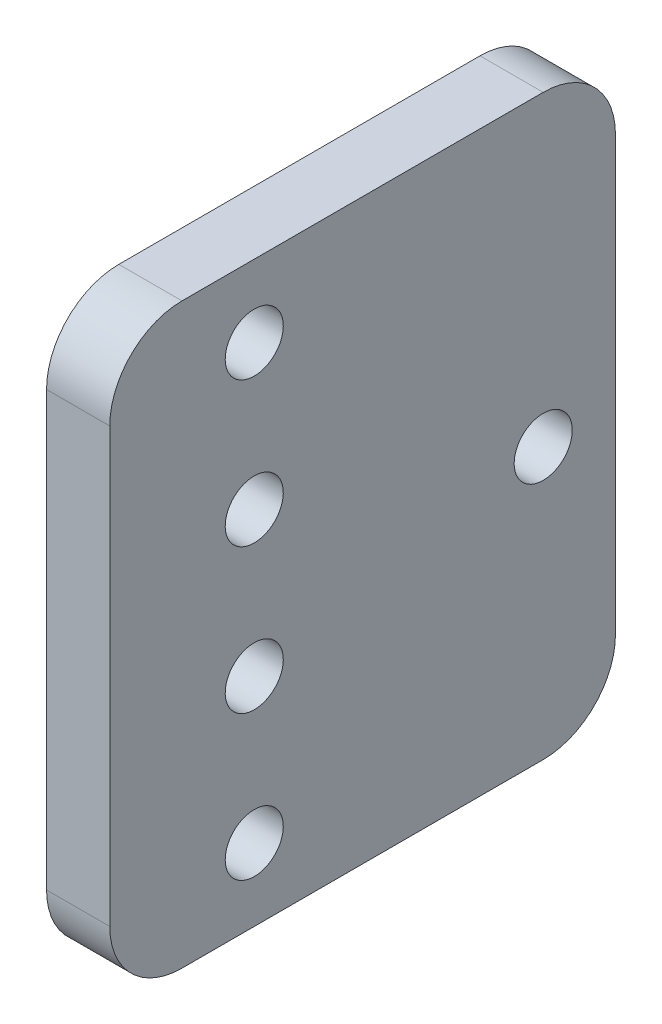
ISO-10303-21;
HEADER;
FILE_DESCRIPTION(('STEP AP214'),'2;1');
FILE_NAME('part.step','',(''),(''),'','','');
FILE_SCHEMA(('AUTOMOTIVE_DESIGN { 1 0 10303 214 1 1 1 1 }'));
ENDSEC;
DATA;
#1=APPLICATION_CONTEXT('core data for automotive mechanical design processes');
#2=APPLICATION_PROTOCOL_DEFINITION('international standard','automotive_design',2000,#1);
#3=PRODUCT_CONTEXT('',#1,'mechanical');
#4=PRODUCT('Part','Part','',(#3));
#5=PRODUCT_RELATED_PRODUCT_CATEGORY('part','',(#4));
#6=PRODUCT_DEFINITION_FORMATION('','',#4);
#7=PRODUCT_DEFINITION_CONTEXT('part definition',#1,'design');
#8=PRODUCT_DEFINITION('design','',#6,#7);
#9=PRODUCT_DEFINITION_SHAPE('','',#8);
#10=(LENGTH_UNIT() NAMED_UNIT(*) SI_UNIT(.MILLI.,.METRE.));
#11=(NAMED_UNIT(*) PLANE_ANGLE_UNIT() SI_UNIT($,.RADIAN.));
#12=(NAMED_UNIT(*) SI_UNIT($,.STERADIAN.) SOLID_ANGLE_UNIT());
#13=UNCERTAINTY_MEASURE_WITH_UNIT(LENGTH_MEASURE(1.E-05),#10,'distance_accuracy_value','');
#14=(GEOMETRIC_REPRESENTATION_CONTEXT(3) GLOBAL_UNCERTAINTY_ASSIGNED_CONTEXT((#13)) GLOBAL_UNIT_ASSIGNED_CONTEXT((#10,
#11,#12)) REPRESENTATION_CONTEXT('',''));
#15=CARTESIAN_POINT('',(0.,0.,0.));
#16=DIRECTION('',(0.,0.,1.));
#17=DIRECTION('',(1.,0.,0.));
#18=AXIS2_PLACEMENT_3D('',#15,#16,#17);
#19=CARTESIAN_POINT('',(329.40625,29.4337049223951,749.3));
#20=DIRECTION('',(0.,1.,0.));
#21=DIRECTION('',(0.,0.,1.));
#22=AXIS2_PLACEMENT_3D('',#19,#20,#21);
#23=PLANE('',#22);
#24=DIRECTION('',(0.,0.,-1.));
#25=VECTOR('',#24,1.);
#26=CARTESIAN_POINT('',(323.85,29.4337049223951,749.3));
#27=LINE('',#26,#25);
#28=CARTESIAN_POINT('',(323.85,29.4337049223951,755.65));
#29=VERTEX_POINT('',#28);
#30=CARTESIAN_POINT('',(323.85,29.4337049223951,723.9));
#31=VERTEX_POINT('',#30);
#32=EDGE_CURVE('E203',#29,#31,#27,.T.);
#33=ORIENTED_EDGE('',*,*,#32,.F.);
#34=DIRECTION('',(-1.,0.,0.));
#35=VECTOR('',#34,1.);
#36=CARTESIAN_POINT('',(329.40625,29.4337049223951,755.65));
#37=LINE('',#36,#35);
#38=CARTESIAN_POINT('',(329.40625,29.4337049223951,755.65));
#39=VERTEX_POINT('',#38);
#40=EDGE_CURVE('E26',#29,#39,#37,.F.);
#41=ORIENTED_EDGE('',*,*,#40,.T.);
#42=DIRECTION('',(0.,0.,-1.));
#43=VECTOR('',#42,1.);
#44=CARTESIAN_POINT('',(329.40625,29.4337049223951,749.3));
#45=LINE('',#44,#43);
#46=CARTESIAN_POINT('',(329.40625,29.4337049223951,723.9));
#47=VERTEX_POINT('',#46);
#48=EDGE_CURVE('E137',#39,#47,#45,.T.);
#49=ORIENTED_EDGE('',*,*,#48,.T.);
#50=DIRECTION('',(-1.,0.,0.));
#51=VECTOR('',#50,1.);
#52=CARTESIAN_POINT('',(329.40625,29.4337049223951,723.9));
#53=LINE('',#52,#51);
#54=EDGE_CURVE('E157',#47,#31,#53,.T.);
#55=ORIENTED_EDGE('',*,*,#54,.T.);
#56=EDGE_LOOP('',(#33,#41,#49,#55));
#57=FACE_BOUND('',#56,.T.);
#58=ADVANCED_FACE('F17',(#57),#23,.T.);
#59=CARTESIAN_POINT('',(329.40625,4.03370492239506,762.));
#60=DIRECTION('',(0.,0.,-1.));
#61=DIRECTION('',(-1.,0.,0.));
#62=AXIS2_PLACEMENT_3D('',#59,#60,#61);
#63=PLANE('',#62);
#64=DIRECTION('',(0.,-1.,0.));
#65=VECTOR('',#64,1.);
#66=CARTESIAN_POINT('',(329.40625,4.03370492239506,762.));
#67=LINE('',#66,#65);
#68=CARTESIAN_POINT('',(329.40625,23.0837049223951,762.));
#69=VERTEX_POINT('',#68);
#70=CARTESIAN_POINT('',(329.40625,-15.0162950776049,762.));
#71=VERTEX_POINT('',#70);
#72=EDGE_CURVE('E211',#69,#71,#67,.T.);
#73=ORIENTED_EDGE('',*,*,#72,.F.);
#74=DIRECTION('',(-1.,0.,0.));
#75=VECTOR('',#74,1.);
#76=CARTESIAN_POINT('',(323.85,23.0837049223951,762.));
#77=LINE('',#76,#75);
#78=CARTESIAN_POINT('',(323.85,23.0837049223951,762.));
#79=VERTEX_POINT('',#78);
#80=EDGE_CURVE('E171',#69,#79,#77,.T.);
#81=ORIENTED_EDGE('',*,*,#80,.T.);
#82=DIRECTION('',(0.,-1.,0.));
#83=VECTOR('',#82,1.);
#84=CARTESIAN_POINT('',(323.85,4.03370492239506,762.));
#85=LINE('',#84,#83);
#86=CARTESIAN_POINT('',(323.85,-15.0162950776049,762.));
#87=VERTEX_POINT('',#86);
#88=EDGE_CURVE('E119',#79,#87,#85,.T.);
#89=ORIENTED_EDGE('',*,*,#88,.T.);
#90=DIRECTION('',(-1.,0.,0.));
#91=VECTOR('',#90,1.);
#92=CARTESIAN_POINT('',(329.40625,-15.0162950776049,762.));
#93=LINE('',#92,#91);
#94=EDGE_CURVE('E88',#87,#71,#93,.F.);
#95=ORIENTED_EDGE('',*,*,#94,.T.);
#96=EDGE_LOOP('',(#73,#81,#89,#95));
#97=FACE_BOUND('',#96,.T.);
#98=ADVANCED_FACE('F209',(#97),#63,.F.);
#99=CARTESIAN_POINT('',(329.40625,-21.3662950776049,739.775));
#100=DIRECTION('',(0.,1.,0.));
#101=DIRECTION('',(0.,0.,1.));
#102=AXIS2_PLACEMENT_3D('',#99,#100,#101);
#103=PLANE('',#102);
#104=DIRECTION('',(0.,0.,-1.));
#105=VECTOR('',#104,1.);
#106=CARTESIAN_POINT('',(323.85,-21.3662950776049,739.775));
#107=LINE('',#106,#105);
#108=CARTESIAN_POINT('',(323.85,-21.3662950776049,755.65));
#109=VERTEX_POINT('',#108);
#110=CARTESIAN_POINT('',(323.85,-21.3662950776049,723.9));
#111=VERTEX_POINT('',#110);
#112=EDGE_CURVE('E96',#109,#111,#107,.T.);
#113=ORIENTED_EDGE('',*,*,#112,.T.);
#114=DIRECTION('',(-1.,0.,0.));
#115=VECTOR('',#114,1.);
#116=CARTESIAN_POINT('',(329.40625,-21.3662950776049,723.9));
#117=LINE('',#116,#115);
#118=CARTESIAN_POINT('',(329.40625,-21.3662950776049,723.9));
#119=VERTEX_POINT('',#118);
#120=EDGE_CURVE('E150',#111,#119,#117,.F.);
#121=ORIENTED_EDGE('',*,*,#120,.T.);
#122=DIRECTION('',(0.,0.,-1.));
#123=VECTOR('',#122,1.);
#124=CARTESIAN_POINT('',(329.40625,-21.3662950776049,739.775));
#125=LINE('',#124,#123);
#126=CARTESIAN_POINT('',(329.40625,-21.3662950776049,755.65));
#127=VERTEX_POINT('',#126);
#128=EDGE_CURVE('E99',#127,#119,#125,.T.);
#129=ORIENTED_EDGE('',*,*,#128,.F.);
#130=DIRECTION('',(-1.,0.,0.));
#131=VECTOR('',#130,1.);
#132=CARTESIAN_POINT('',(329.40625,-21.3662950776049,755.65));
#133=LINE('',#132,#131);
#134=EDGE_CURVE('E86',#127,#109,#133,.T.);
#135=ORIENTED_EDGE('',*,*,#134,.T.);
#136=EDGE_LOOP('',(#113,#121,#129,#135));
#137=FACE_BOUND('',#136,.T.);
#138=ADVANCED_FACE('F95',(#137),#103,.F.);
#139=CARTESIAN_POINT('',(329.40625,-2.31629507760492,749.3));
#140=DIRECTION('',(-1.,0.,0.));
#141=DIRECTION('',(0.,-1.,0.));
#142=AXIS2_PLACEMENT_3D('',#139,#140,#141);
#143=CYLINDRICAL_SURFACE('',#142,2.5527);
#144=CARTESIAN_POINT('',(329.40625,-2.31629507760492,749.3));
#145=DIRECTION('',(1.,0.,0.));
#146=DIRECTION('',(0.,1.,0.));
#147=AXIS2_PLACEMENT_3D('',#144,#145,#146);
#148=CIRCLE('',#147,2.5527);
#149=CARTESIAN_POINT('',(329.40625,0.236404922395075,749.3));
#150=VERTEX_POINT('',#149);
#151=EDGE_CURVE('E178',#150,#150,#148,.T.);
#152=ORIENTED_EDGE('',*,*,#151,.T.);
#153=EDGE_LOOP('',(#152));
#154=FACE_BOUND('',#153,.T.);
#155=CARTESIAN_POINT('',(323.85,-2.31629507760492,749.3));
#156=DIRECTION('',(1.,0.,0.));
#157=DIRECTION('',(0.,1.,0.));
#158=AXIS2_PLACEMENT_3D('',#155,#156,#157);
#159=CIRCLE('',#158,2.5527);
#160=CARTESIAN_POINT('',(323.85,0.236404922395075,749.3));
#161=VERTEX_POINT('',#160);
#162=EDGE_CURVE('E130',#161,#161,#159,.T.);
#163=ORIENTED_EDGE('',*,*,#162,.F.);
#164=EDGE_LOOP('',(#163));
#165=FACE_BOUND('',#164,.T.);
#166=ADVANCED_FACE('F253',(#154,#165),#143,.F.);
#167=CARTESIAN_POINT('',(329.40625,10.3837049223951,749.3));
#168=DIRECTION('',(-1.,0.,0.));
#169=DIRECTION('',(0.,-1.,0.));
#170=AXIS2_PLACEMENT_3D('',#167,#168,#169);
#171=CYLINDRICAL_SURFACE('',#170,2.5527);
#172=CARTESIAN_POINT('',(329.40625,10.3837049223951,749.3));
#173=DIRECTION('',(1.,0.,0.));
#174=DIRECTION('',(0.,1.,0.));
#175=AXIS2_PLACEMENT_3D('',#172,#173,#174);
#176=CIRCLE('',#175,2.5527);
#177=CARTESIAN_POINT('',(329.40625,12.9364049223951,749.3));
#178=VERTEX_POINT('',#177);
#179=EDGE_CURVE('E180',#178,#178,#176,.T.);
#180=ORIENTED_EDGE('',*,*,#179,.T.);
#181=EDGE_LOOP('',(#180));
#182=FACE_BOUND('',#181,.T.);
#183=CARTESIAN_POINT('',(323.85,10.3837049223951,749.3));
#184=DIRECTION('',(1.,0.,0.));
#185=DIRECTION('',(0.,1.,0.));
#186=AXIS2_PLACEMENT_3D('',#183,#184,#185);
#187=CIRCLE('',#186,2.5527);
#188=CARTESIAN_POINT('',(323.85,12.9364049223951,749.3));
#189=VERTEX_POINT('',#188);
#190=EDGE_CURVE('E126',#189,#189,#187,.T.);
#191=ORIENTED_EDGE('',*,*,#190,.F.);
#192=EDGE_LOOP('',(#191));
#193=FACE_BOUND('',#192,.T.);
#194=ADVANCED_FACE('F259',(#182,#193),#171,.F.);
#195=CARTESIAN_POINT('',(329.40625,23.0837049223951,749.3));
#196=DIRECTION('',(-1.,0.,0.));
#197=DIRECTION('',(0.,-1.,0.));
#198=AXIS2_PLACEMENT_3D('',#195,#196,#197);
#199=CYLINDRICAL_SURFACE('',#198,2.5527);
#200=CARTESIAN_POINT('',(329.40625,23.0837049223951,749.3));
#201=DIRECTION('',(1.,0.,0.));
#202=DIRECTION('',(0.,1.,0.));
#203=AXIS2_PLACEMENT_3D('',#200,#201,#202);
#204=CIRCLE('',#203,2.5527);
#205=CARTESIAN_POINT('',(329.40625,25.6364049223951,749.3));
#206=VERTEX_POINT('',#205);
#207=EDGE_CURVE('E183',#206,#206,#204,.T.);
#208=ORIENTED_EDGE('',*,*,#207,.T.);
#209=EDGE_LOOP('',(#208));
#210=FACE_BOUND('',#209,.T.);
#211=CARTESIAN_POINT('',(323.85,23.0837049223951,749.3));
#212=DIRECTION('',(1.,0.,0.));
#213=DIRECTION('',(0.,1.,0.));
#214=AXIS2_PLACEMENT_3D('',#211,#212,#213);
#215=CIRCLE('',#214,2.5527);
#216=CARTESIAN_POINT('',(323.85,25.6364049223951,749.3));
#217=VERTEX_POINT('',#216);
#218=EDGE_CURVE('E116',#217,#217,#215,.T.);
#219=ORIENTED_EDGE('',*,*,#218,.F.);
#220=EDGE_LOOP('',(#219));
#221=FACE_BOUND('',#220,.T.);
#222=ADVANCED_FACE('F256',(#210,#221),#199,.F.);
#223=CARTESIAN_POINT('',(329.40625,2.44620492239523,723.9));
#224=DIRECTION('',(-1.,0.,0.));
#225=DIRECTION('',(0.,-1.,0.));
#226=AXIS2_PLACEMENT_3D('',#223,#224,#225);
#227=CYLINDRICAL_SURFACE('',#226,2.5527);
#228=CARTESIAN_POINT('',(329.40625,2.44620492239523,723.9));
#229=DIRECTION('',(1.,0.,0.));
#230=DIRECTION('',(0.,1.,0.));
#231=AXIS2_PLACEMENT_3D('',#228,#229,#230);
#232=CIRCLE('',#231,2.5527);
#233=CARTESIAN_POINT('',(329.40625,4.99890492239524,723.9));
#234=VERTEX_POINT('',#233);
#235=EDGE_CURVE('E185',#234,#234,#232,.T.);
#236=ORIENTED_EDGE('',*,*,#235,.T.);
#237=EDGE_LOOP('',(#236));
#238=FACE_BOUND('',#237,.T.);
#239=CARTESIAN_POINT('',(323.85,2.44620492239523,723.9));
#240=DIRECTION('',(1.,0.,0.));
#241=DIRECTION('',(0.,1.,0.));
#242=AXIS2_PLACEMENT_3D('',#239,#240,#241);
#243=CIRCLE('',#242,2.5527);
#244=CARTESIAN_POINT('',(323.85,4.99890492239524,723.9));
#245=VERTEX_POINT('',#244);
#246=EDGE_CURVE('E108',#245,#245,#243,.T.);
#247=ORIENTED_EDGE('',*,*,#246,.F.);
#248=EDGE_LOOP('',(#247));
#249=FACE_BOUND('',#248,.T.);
#250=ADVANCED_FACE('F250',(#238,#249),#227,.F.);
#251=CARTESIAN_POINT('',(329.40625,4.03370492239507,717.55));
#252=DIRECTION('',(0.,0.,-1.));
#253=DIRECTION('',(-1.,0.,0.));
#254=AXIS2_PLACEMENT_3D('',#251,#252,#253);
#255=PLANE('',#254);
#256=DIRECTION('',(0.,-1.,0.));
#257=VECTOR('',#256,1.);
#258=CARTESIAN_POINT('',(323.85,4.03370492239507,717.55));
#259=LINE('',#258,#257);
#260=CARTESIAN_POINT('',(323.85,23.0837049223951,717.55));
#261=VERTEX_POINT('',#260);
#262=CARTESIAN_POINT('',(323.85,-15.0162950776049,717.55));
#263=VERTEX_POINT('',#262);
#264=EDGE_CURVE('E109',#261,#263,#259,.T.);
#265=ORIENTED_EDGE('',*,*,#264,.F.);
#266=DIRECTION('',(-1.,0.,0.));
#267=VECTOR('',#266,1.);
#268=CARTESIAN_POINT('',(329.40625,23.0837049223951,717.55));
#269=LINE('',#268,#267);
#270=CARTESIAN_POINT('',(329.40625,23.0837049223951,717.55));
#271=VERTEX_POINT('',#270);
#272=EDGE_CURVE('E164',#261,#271,#269,.F.);
#273=ORIENTED_EDGE('',*,*,#272,.T.);
#274=DIRECTION('',(0.,-1.,0.));
#275=VECTOR('',#274,1.);
#276=CARTESIAN_POINT('',(329.40625,4.03370492239507,717.55));
#277=LINE('',#276,#275);
#278=CARTESIAN_POINT('',(329.40625,-15.0162950776049,717.55));
#279=VERTEX_POINT('',#278);
#280=EDGE_CURVE('E189',#271,#279,#277,.T.);
#281=ORIENTED_EDGE('',*,*,#280,.T.);
#282=DIRECTION('',(-1.,0.,0.));
#283=VECTOR('',#282,1.);
#284=CARTESIAN_POINT('',(323.85,-15.0162950776049,717.55));
#285=LINE('',#284,#283);
#286=EDGE_CURVE('E144',#279,#263,#285,.T.);
#287=ORIENTED_EDGE('',*,*,#286,.T.);
#288=EDGE_LOOP('',(#265,#273,#281,#287));
#289=FACE_BOUND('',#288,.T.);
#290=ADVANCED_FACE('F226',(#289),#255,.T.);
#291=CARTESIAN_POINT('',(329.40625,-15.0162950776049,749.3));
#292=DIRECTION('',(-1.,0.,0.));
#293=DIRECTION('',(0.,-1.,0.));
#294=AXIS2_PLACEMENT_3D('',#291,#292,#293);
#295=CYLINDRICAL_SURFACE('',#294,2.5527);
#296=CARTESIAN_POINT('',(329.40625,-15.0162950776049,749.3));
#297=DIRECTION('',(1.,0.,0.));
#298=DIRECTION('',(0.,1.,0.));
#299=AXIS2_PLACEMENT_3D('',#296,#297,#298);
#300=CIRCLE('',#299,2.5527);
#301=CARTESIAN_POINT('',(329.40625,-12.4635950776049,749.3));
#302=VERTEX_POINT('',#301);
#303=EDGE_CURVE('E101',#302,#302,#300,.T.);
#304=ORIENTED_EDGE('',*,*,#303,.T.);
#305=EDGE_LOOP('',(#304));
#306=FACE_BOUND('',#305,.T.);
#307=CARTESIAN_POINT('',(323.85,-15.0162950776049,749.3));
#308=DIRECTION('',(1.,0.,0.));
#309=DIRECTION('',(0.,1.,0.));
#310=AXIS2_PLACEMENT_3D('',#307,#308,#309);
#311=CIRCLE('',#310,2.5527);
#312=CARTESIAN_POINT('',(323.85,-12.4635950776049,749.3));
#313=VERTEX_POINT('',#312);
#314=EDGE_CURVE('E134',#313,#313,#311,.T.);
#315=ORIENTED_EDGE('',*,*,#314,.F.);
#316=EDGE_LOOP('',(#315));
#317=FACE_BOUND('',#316,.T.);
#318=ADVANCED_FACE('F249',(#306,#317),#295,.F.);
#319=CARTESIAN_POINT('',(329.40625,-123.508232409556,552.45));
#320=DIRECTION('',(1.,0.,0.));
#321=DIRECTION('',(0.,1.,0.));
#322=AXIS2_PLACEMENT_3D('',#319,#320,#321);
#323=PLANE('',#322);
#324=ORIENTED_EDGE('',*,*,#48,.F.);
#325=CARTESIAN_POINT('',(329.40625,23.0837049223951,755.65));
#326=DIRECTION('',(1.,0.,0.));
#327=DIRECTION('',(0.,1.,0.));
#328=AXIS2_PLACEMENT_3D('',#325,#326,#327);
#329=CIRCLE('',#328,6.35);
#330=EDGE_CURVE('E11',#39,#69,#329,.T.);
#331=ORIENTED_EDGE('',*,*,#330,.T.);
#332=ORIENTED_EDGE('',*,*,#72,.T.);
#333=CARTESIAN_POINT('',(329.40625,-15.0162950776049,755.65));
#334=DIRECTION('',(1.,0.,0.));
#335=DIRECTION('',(0.,1.,0.));
#336=AXIS2_PLACEMENT_3D('',#333,#334,#335);
#337=CIRCLE('',#336,6.35);
#338=EDGE_CURVE('E141',#71,#127,#337,.T.);
#339=ORIENTED_EDGE('',*,*,#338,.T.);
#340=ORIENTED_EDGE('',*,*,#128,.T.);
#341=CARTESIAN_POINT('',(329.40625,-15.0162950776049,723.9));
#342=DIRECTION('',(1.,0.,0.));
#343=DIRECTION('',(0.,1.,0.));
#344=AXIS2_PLACEMENT_3D('',#341,#342,#343);
#345=CIRCLE('',#344,6.35);
#346=EDGE_CURVE('E153',#119,#279,#345,.T.);
#347=ORIENTED_EDGE('',*,*,#346,.T.);
#348=ORIENTED_EDGE('',*,*,#280,.F.);
#349=CARTESIAN_POINT('',(329.40625,23.0837049223951,723.9));
#350=DIRECTION('',(1.,0.,0.));
#351=DIRECTION('',(0.,1.,0.));
#352=AXIS2_PLACEMENT_3D('',#349,#350,#351);
#353=CIRCLE('',#352,6.35);
#354=EDGE_CURVE('E167',#271,#47,#353,.T.);
#355=ORIENTED_EDGE('',*,*,#354,.T.);
#356=EDGE_LOOP('',(#324,#331,#332,#339,#340,#347,#348,#355));
#357=FACE_BOUND('',#356,.T.);
#358=ORIENTED_EDGE('',*,*,#235,.F.);
#359=EDGE_LOOP('',(#358));
#360=FACE_BOUND('',#359,.T.);
#361=ORIENTED_EDGE('',*,*,#207,.F.);
#362=EDGE_LOOP('',(#361));
#363=FACE_BOUND('',#362,.T.);
#364=ORIENTED_EDGE('',*,*,#179,.F.);
#365=EDGE_LOOP('',(#364));
#366=FACE_BOUND('',#365,.T.);
#367=ORIENTED_EDGE('',*,*,#151,.F.);
#368=EDGE_LOOP('',(#367));
#369=FACE_BOUND('',#368,.T.);
#370=ORIENTED_EDGE('',*,*,#303,.F.);
#371=EDGE_LOOP('',(#370));
#372=FACE_BOUND('',#371,.T.);
#373=ADVANCED_FACE('F215',(#357,#360,#363,#366,#369,#372),#323,.T.);
#374=CARTESIAN_POINT('',(323.85,-123.508232409556,552.45));
#375=DIRECTION('',(1.,0.,0.));
#376=DIRECTION('',(0.,1.,0.));
#377=AXIS2_PLACEMENT_3D('',#374,#375,#376);
#378=PLANE('',#377);
#379=ORIENTED_EDGE('',*,*,#88,.F.);
#380=CARTESIAN_POINT('',(323.85,23.0837049223951,755.65));
#381=DIRECTION('',(1.,0.,0.));
#382=DIRECTION('',(0.,1.,0.));
#383=AXIS2_PLACEMENT_3D('',#380,#381,#382);
#384=CIRCLE('',#383,6.35);
#385=EDGE_CURVE('E40',#79,#29,#384,.F.);
#386=ORIENTED_EDGE('',*,*,#385,.T.);
#387=ORIENTED_EDGE('',*,*,#32,.T.);
#388=CARTESIAN_POINT('',(323.85,23.0837049223951,723.9));
#389=DIRECTION('',(1.,0.,0.));
#390=DIRECTION('',(0.,1.,0.));
#391=AXIS2_PLACEMENT_3D('',#388,#389,#390);
#392=CIRCLE('',#391,6.35);
#393=EDGE_CURVE('E161',#31,#261,#392,.F.);
#394=ORIENTED_EDGE('',*,*,#393,.T.);
#395=ORIENTED_EDGE('',*,*,#264,.T.);
#396=CARTESIAN_POINT('',(323.85,-15.0162950776049,723.9));
#397=DIRECTION('',(1.,0.,0.));
#398=DIRECTION('',(0.,1.,0.));
#399=AXIS2_PLACEMENT_3D('',#396,#397,#398);
#400=CIRCLE('',#399,6.35);
#401=EDGE_CURVE('E106',#263,#111,#400,.F.);
#402=ORIENTED_EDGE('',*,*,#401,.T.);
#403=ORIENTED_EDGE('',*,*,#112,.F.);
#404=CARTESIAN_POINT('',(323.85,-15.0162950776049,755.65));
#405=DIRECTION('',(1.,0.,0.));
#406=DIRECTION('',(0.,1.,0.));
#407=AXIS2_PLACEMENT_3D('',#404,#405,#406);
#408=CIRCLE('',#407,6.35);
#409=EDGE_CURVE('E82',#109,#87,#408,.F.);
#410=ORIENTED_EDGE('',*,*,#409,.T.);
#411=EDGE_LOOP('',(#379,#386,#387,#394,#395,#402,#403,#410));
#412=FACE_BOUND('',#411,.T.);
#413=ORIENTED_EDGE('',*,*,#246,.T.);
#414=EDGE_LOOP('',(#413));
#415=FACE_BOUND('',#414,.T.);
#416=ORIENTED_EDGE('',*,*,#218,.T.);
#417=EDGE_LOOP('',(#416));
#418=FACE_BOUND('',#417,.T.);
#419=ORIENTED_EDGE('',*,*,#190,.T.);
#420=EDGE_LOOP('',(#419));
#421=FACE_BOUND('',#420,.T.);
#422=ORIENTED_EDGE('',*,*,#162,.T.);
#423=EDGE_LOOP('',(#422));
#424=FACE_BOUND('',#423,.T.);
#425=ORIENTED_EDGE('',*,*,#314,.T.);
#426=EDGE_LOOP('',(#425));
#427=FACE_BOUND('',#426,.T.);
#428=ADVANCED_FACE('F103',(#412,#415,#418,#421,#424,#427),#378,.F.);
#429=CARTESIAN_POINT('',(329.40625,-15.0162950776049,755.65));
#430=DIRECTION('',(-1.,0.,0.));
#431=DIRECTION('',(0.,-1.,0.));
#432=AXIS2_PLACEMENT_3D('',#429,#430,#431);
#433=CYLINDRICAL_SURFACE('',#432,6.35);
#434=ORIENTED_EDGE('',*,*,#338,.F.);
#435=ORIENTED_EDGE('',*,*,#94,.F.);
#436=ORIENTED_EDGE('',*,*,#409,.F.);
#437=ORIENTED_EDGE('',*,*,#134,.F.);
#438=EDGE_LOOP('',(#434,#435,#436,#437));
#439=FACE_BOUND('',#438,.T.);
#440=ADVANCED_FACE('F85',(#439),#433,.T.);
#441=CARTESIAN_POINT('',(329.40625,-15.0162950776049,723.9));
#442=DIRECTION('',(1.,0.,0.));
#443=DIRECTION('',(0.,1.,0.));
#444=AXIS2_PLACEMENT_3D('',#441,#442,#443);
#445=CYLINDRICAL_SURFACE('',#444,6.35);
#446=ORIENTED_EDGE('',*,*,#346,.F.);
#447=ORIENTED_EDGE('',*,*,#120,.F.);
#448=ORIENTED_EDGE('',*,*,#401,.F.);
#449=ORIENTED_EDGE('',*,*,#286,.F.);
#450=EDGE_LOOP('',(#446,#447,#448,#449));
#451=FACE_BOUND('',#450,.T.);
#452=ADVANCED_FACE('F231',(#451),#445,.T.);
#453=CARTESIAN_POINT('',(329.40625,23.0837049223951,723.9));
#454=DIRECTION('',(-1.,0.,0.));
#455=DIRECTION('',(0.,-1.,0.));
#456=AXIS2_PLACEMENT_3D('',#453,#454,#455);
#457=CYLINDRICAL_SURFACE('',#456,6.35);
#458=ORIENTED_EDGE('',*,*,#354,.F.);
#459=ORIENTED_EDGE('',*,*,#272,.F.);
#460=ORIENTED_EDGE('',*,*,#393,.F.);
#461=ORIENTED_EDGE('',*,*,#54,.F.);
#462=EDGE_LOOP('',(#458,#459,#460,#461));
#463=FACE_BOUND('',#462,.T.);
#464=ADVANCED_FACE('F233',(#463),#457,.T.);
#465=CARTESIAN_POINT('',(329.40625,23.0837049223951,755.65));
#466=DIRECTION('',(1.,0.,0.));
#467=DIRECTION('',(0.,1.,0.));
#468=AXIS2_PLACEMENT_3D('',#465,#466,#467);
#469=CYLINDRICAL_SURFACE('',#468,6.35);
#470=ORIENTED_EDGE('',*,*,#330,.F.);
#471=ORIENTED_EDGE('',*,*,#40,.F.);
#472=ORIENTED_EDGE('',*,*,#385,.F.);
#473=ORIENTED_EDGE('',*,*,#80,.F.);
#474=EDGE_LOOP('',(#470,#471,#472,#473));
#475=FACE_BOUND('',#474,.T.);
#476=ADVANCED_FACE('F19',(#475),#469,.T.);
#477=CLOSED_SHELL('',(#58,#98,#138,#166,#194,#222,#250,#290,#318,#373,#428,#440,#452,#464,#476));
#478=MANIFOLD_SOLID_BREP('B1',#477);
#479=ADVANCED_BREP_SHAPE_REPRESENTATION('',(#18,#478),#14);
#480=SHAPE_DEFINITION_REPRESENTATION(#9,#479);
ENDSEC;
END-ISO-10303-21;
